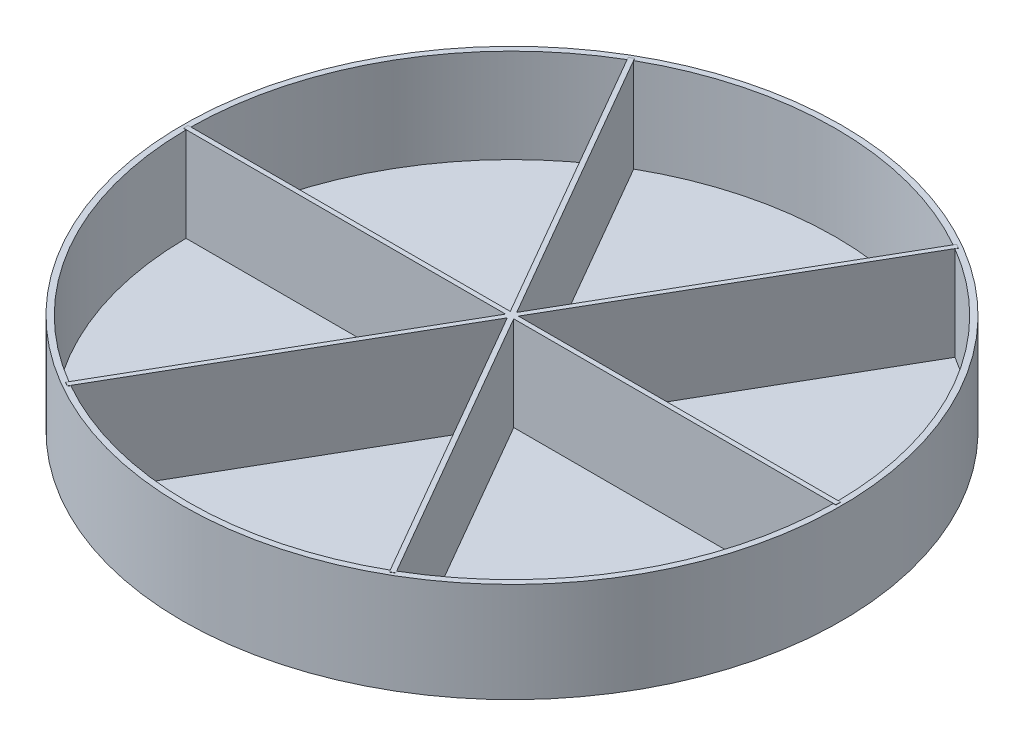
ISO-10303-21;
HEADER;
FILE_DESCRIPTION(('STEP AP214'),'2;1');
FILE_NAME('part.step','',(''),(''),'','','');
FILE_SCHEMA(('AUTOMOTIVE_DESIGN { 1 0 10303 214 1 1 1 1 }'));
ENDSEC;
DATA;
#1=APPLICATION_CONTEXT('core data for automotive mechanical design processes');
#2=APPLICATION_PROTOCOL_DEFINITION('international standard','automotive_design',2000,#1);
#3=PRODUCT_CONTEXT('',#1,'mechanical');
#4=PRODUCT('Part','Part','',(#3));
#5=PRODUCT_RELATED_PRODUCT_CATEGORY('part','',(#4));
#6=PRODUCT_DEFINITION_FORMATION('','',#4);
#7=PRODUCT_DEFINITION_CONTEXT('part definition',#1,'design');
#8=PRODUCT_DEFINITION('design','',#6,#7);
#9=PRODUCT_DEFINITION_SHAPE('','',#8);
#10=(LENGTH_UNIT() NAMED_UNIT(*) SI_UNIT(.MILLI.,.METRE.));
#11=(NAMED_UNIT(*) PLANE_ANGLE_UNIT() SI_UNIT($,.RADIAN.));
#12=(NAMED_UNIT(*) SI_UNIT($,.STERADIAN.) SOLID_ANGLE_UNIT());
#13=UNCERTAINTY_MEASURE_WITH_UNIT(LENGTH_MEASURE(1.E-05),#10,'distance_accuracy_value','');
#14=(GEOMETRIC_REPRESENTATION_CONTEXT(3) GLOBAL_UNCERTAINTY_ASSIGNED_CONTEXT((#13)) GLOBAL_UNIT_ASSIGNED_CONTEXT((#10,
#11,#12)) REPRESENTATION_CONTEXT('',''));
#15=CARTESIAN_POINT('',(0.,0.,0.));
#16=DIRECTION('',(0.,0.,1.));
#17=DIRECTION('',(1.,0.,0.));
#18=AXIS2_PLACEMENT_3D('',#15,#16,#17);
#19=CARTESIAN_POINT('',(0.,53.848,0.));
#20=DIRECTION('',(0.,1.,0.));
#21=DIRECTION('',(0.,0.,1.));
#22=AXIS2_PLACEMENT_3D('',#19,#20,#21);
#23=PLANE('',#22);
#24=CARTESIAN_POINT('',(0.,53.848,0.));
#25=DIRECTION('',(0.,1.,0.));
#26=DIRECTION('',(0.,0.,1.));
#27=AXIS2_PLACEMENT_3D('',#24,#25,#26);
#28=CIRCLE('',#27,177.8);
#29=CARTESIAN_POINT('',(0.,53.848,177.8));
#30=VERTEX_POINT('',#29);
#31=EDGE_CURVE('E494',#30,#30,#28,.T.);
#32=ORIENTED_EDGE('',*,*,#31,.T.);
#33=EDGE_LOOP('',(#32));
#34=FACE_BOUND('',#33,.T.);
#35=DIRECTION('',(0.,0.,1.));
#36=VECTOR('',#35,1.);
#37=CARTESIAN_POINT('',(-175.976362048998,53.848,0.));
#38=LINE('',#37,#36);
#39=CARTESIAN_POINT('',(-175.976362048998,53.848,-1.26999999999995));
#40=VERTEX_POINT('',#39);
#41=CARTESIAN_POINT('',(-175.976362048998,53.848,1.27000000000005));
#42=VERTEX_POINT('',#41);
#43=EDGE_CURVE('E13',#40,#42,#38,.T.);
#44=ORIENTED_EDGE('',*,*,#43,.F.);
#45=DIRECTION('',(1.,0.,0.));
#46=VECTOR('',#45,1.);
#47=CARTESIAN_POINT('',(0.,53.848,-1.26999999999995));
#48=LINE('',#47,#46);
#49=CARTESIAN_POINT('',(-174.620381757113,53.848,-1.26999999999995));
#50=VERTEX_POINT('',#49);
#51=EDGE_CURVE('E482',#40,#50,#48,.T.);
#52=ORIENTED_EDGE('',*,*,#51,.T.);
#53=CARTESIAN_POINT('',(0.,53.848,0.));
#54=DIRECTION('',(0.,1.,0.));
#55=DIRECTION('',(0.,0.,1.));
#56=AXIS2_PLACEMENT_3D('',#53,#54,#55);
#57=CIRCLE('',#56,174.625);
#58=CARTESIAN_POINT('',(-88.4100431413628,53.848,-150.590686620197));
#59=VERTEX_POINT('',#58);
#60=EDGE_CURVE('E589',#59,#50,#57,.T.);
#61=ORIENTED_EDGE('',*,*,#60,.F.);
#62=DIRECTION('',(-0.5,0.,-0.866025403784439));
#63=VECTOR('',#62,1.);
#64=CARTESIAN_POINT('',(-1.0998522628062,53.848,0.634999999999976));
#65=LINE('',#64,#63);
#66=CARTESIAN_POINT('',(-89.0880332873051,53.848,-151.765));
#67=VERTEX_POINT('',#66);
#68=EDGE_CURVE('E441',#59,#67,#65,.T.);
#69=ORIENTED_EDGE('',*,*,#68,.T.);
#70=DIRECTION('',(-0.866025403784439,0.,0.499999999999999));
#71=VECTOR('',#70,1.);
#72=CARTESIAN_POINT('',(-87.9881810244988,53.848,-152.4));
#73=LINE('',#72,#71);
#74=CARTESIAN_POINT('',(-86.8883287616926,53.848,-153.035));
#75=VERTEX_POINT('',#74);
#76=EDGE_CURVE('E515',#75,#67,#73,.T.);
#77=ORIENTED_EDGE('',*,*,#76,.F.);
#78=DIRECTION('',(-0.5,0.,-0.866025403784439));
#79=VECTOR('',#78,1.);
#80=CARTESIAN_POINT('',(1.09985226280627,53.848,-0.635000000000017));
#81=LINE('',#80,#79);
#82=CARTESIAN_POINT('',(-86.2103386157503,53.848,-151.860686620197));
#83=VERTEX_POINT('',#82);
#84=EDGE_CURVE('E430',#83,#75,#81,.T.);
#85=ORIENTED_EDGE('',*,*,#84,.F.);
#86=CARTESIAN_POINT('',(86.2103386157503,53.848,-151.860686620197));
#87=VERTEX_POINT('',#86);
#88=EDGE_CURVE('E592',#87,#83,#57,.T.);
#89=ORIENTED_EDGE('',*,*,#88,.F.);
#90=DIRECTION('',(0.5,0.,-0.866025403784439));
#91=VECTOR('',#90,1.);
#92=CARTESIAN_POINT('',(-1.0998522628063,53.848,-0.635000000000038));
#93=LINE('',#92,#91);
#94=CARTESIAN_POINT('',(86.8883287616926,53.848,-153.035));
#95=VERTEX_POINT('',#94);
#96=EDGE_CURVE('E436',#87,#95,#93,.T.);
#97=ORIENTED_EDGE('',*,*,#96,.T.);
#98=DIRECTION('',(-0.866025403784439,0.,-0.499999999999999));
#99=VECTOR('',#98,1.);
#100=CARTESIAN_POINT('',(87.9881810244988,53.848,-152.4));
#101=LINE('',#100,#99);
#102=CARTESIAN_POINT('',(89.0880332873051,53.848,-151.765));
#103=VERTEX_POINT('',#102);
#104=EDGE_CURVE('E518',#103,#95,#101,.T.);
#105=ORIENTED_EDGE('',*,*,#104,.F.);
#106=DIRECTION('',(0.5,0.,-0.866025403784439));
#107=VECTOR('',#106,1.);
#108=CARTESIAN_POINT('',(1.09985226280617,53.848,0.634999999999962));
#109=LINE('',#108,#107);
#110=CARTESIAN_POINT('',(88.4100431413628,53.848,-150.590686620197));
#111=VERTEX_POINT('',#110);
#112=EDGE_CURVE('E445',#111,#103,#109,.T.);
#113=ORIENTED_EDGE('',*,*,#112,.F.);
#114=CARTESIAN_POINT('',(174.620381757113,53.848,-1.26999999999995));
#115=VERTEX_POINT('',#114);
#116=EDGE_CURVE('E594',#115,#111,#57,.T.);
#117=ORIENTED_EDGE('',*,*,#116,.F.);
#118=DIRECTION('',(1.,0.,0.));
#119=VECTOR('',#118,1.);
#120=CARTESIAN_POINT('',(0.,53.848,-1.26999999999995));
#121=LINE('',#120,#119);
#122=CARTESIAN_POINT('',(175.976362048998,53.848,-1.26999999999995));
#123=VERTEX_POINT('',#122);
#124=EDGE_CURVE('E474',#115,#123,#121,.T.);
#125=ORIENTED_EDGE('',*,*,#124,.T.);
#126=DIRECTION('',(0.,0.,-1.));
#127=VECTOR('',#126,1.);
#128=CARTESIAN_POINT('',(175.976362048998,53.848,0.));
#129=LINE('',#128,#127);
#130=CARTESIAN_POINT('',(175.976362048998,53.848,1.27000000000005));
#131=VERTEX_POINT('',#130);
#132=EDGE_CURVE('E119',#131,#123,#129,.T.);
#133=ORIENTED_EDGE('',*,*,#132,.F.);
#134=DIRECTION('',(1.,0.,0.));
#135=VECTOR('',#134,1.);
#136=CARTESIAN_POINT('',(0.,53.848,1.27000000000005));
#137=LINE('',#136,#135);
#138=CARTESIAN_POINT('',(174.620381757113,53.848,1.27000000000005));
#139=VERTEX_POINT('',#138);
#140=EDGE_CURVE('E468',#139,#131,#137,.T.);
#141=ORIENTED_EDGE('',*,*,#140,.F.);
#142=CARTESIAN_POINT('',(88.4100431413629,53.848,150.590686620197));
#143=VERTEX_POINT('',#142);
#144=EDGE_CURVE('E488',#143,#139,#57,.T.);
#145=ORIENTED_EDGE('',*,*,#144,.F.);
#146=DIRECTION('',(-0.5,0.,-0.866025403784439));
#147=VECTOR('',#146,1.);
#148=CARTESIAN_POINT('',(1.09985226280627,53.848,-0.635000000000017));
#149=LINE('',#148,#147);
#150=CARTESIAN_POINT('',(89.0880332873052,53.848,151.765));
#151=VERTEX_POINT('',#150);
#152=EDGE_CURVE('E455',#151,#143,#149,.T.);
#153=ORIENTED_EDGE('',*,*,#152,.F.);
#154=DIRECTION('',(0.866025403784439,0.,-0.499999999999999));
#155=VECTOR('',#154,1.);
#156=CARTESIAN_POINT('',(87.9881810244988,53.848,152.4));
#157=LINE('',#156,#155);
#158=CARTESIAN_POINT('',(86.8883287616928,53.848,153.035));
#159=VERTEX_POINT('',#158);
#160=EDGE_CURVE('E524',#159,#151,#157,.T.);
#161=ORIENTED_EDGE('',*,*,#160,.F.);
#162=DIRECTION('',(-0.5,0.,-0.866025403784439));
#163=VECTOR('',#162,1.);
#164=CARTESIAN_POINT('',(-1.0998522628062,53.848,0.634999999999976));
#165=LINE('',#164,#163);
#166=CARTESIAN_POINT('',(86.2103386157504,53.848,151.860686620197));
#167=VERTEX_POINT('',#166);
#168=EDGE_CURVE('E325',#159,#167,#165,.T.);
#169=ORIENTED_EDGE('',*,*,#168,.T.);
#170=CARTESIAN_POINT('',(-86.2103386157505,53.848,151.860686620197));
#171=VERTEX_POINT('',#170);
#172=EDGE_CURVE('E484',#171,#167,#57,.T.);
#173=ORIENTED_EDGE('',*,*,#172,.F.);
#174=DIRECTION('',(0.5,0.,-0.866025403784439));
#175=VECTOR('',#174,1.);
#176=CARTESIAN_POINT('',(1.09985226280617,53.848,0.634999999999962));
#177=LINE('',#176,#175);
#178=CARTESIAN_POINT('',(-86.8883287616928,53.848,153.035));
#179=VERTEX_POINT('',#178);
#180=EDGE_CURVE('E463',#179,#171,#177,.T.);
#181=ORIENTED_EDGE('',*,*,#180,.F.);
#182=DIRECTION('',(0.866025403784439,0.,0.499999999999999));
#183=VECTOR('',#182,1.);
#184=CARTESIAN_POINT('',(-87.9881810244988,53.848,152.4));
#185=LINE('',#184,#183);
#186=CARTESIAN_POINT('',(-89.0880332873053,53.848,151.765));
#187=VERTEX_POINT('',#186);
#188=EDGE_CURVE('E521',#187,#179,#185,.T.);
#189=ORIENTED_EDGE('',*,*,#188,.F.);
#190=DIRECTION('',(0.5,0.,-0.866025403784439));
#191=VECTOR('',#190,1.);
#192=CARTESIAN_POINT('',(-1.0998522628063,53.848,-0.635000000000038));
#193=LINE('',#192,#191);
#194=CARTESIAN_POINT('',(-88.410043141363,53.848,150.590686620197));
#195=VERTEX_POINT('',#194);
#196=EDGE_CURVE('E451',#187,#195,#193,.T.);
#197=ORIENTED_EDGE('',*,*,#196,.T.);
#198=CARTESIAN_POINT('',(-174.620381757113,53.848,1.27000000000005));
#199=VERTEX_POINT('',#198);
#200=EDGE_CURVE('E487',#199,#195,#57,.T.);
#201=ORIENTED_EDGE('',*,*,#200,.F.);
#202=DIRECTION('',(1.,0.,0.));
#203=VECTOR('',#202,1.);
#204=CARTESIAN_POINT('',(0.,53.848,1.27000000000005));
#205=LINE('',#204,#203);
#206=EDGE_CURVE('E126',#42,#199,#205,.T.);
#207=ORIENTED_EDGE('',*,*,#206,.F.);
#208=EDGE_LOOP('',(#44,#52,#61,#69,#77,#85,#89,#97,#105,#113,#117,#125,#133,#141,#145,#153,#161,
#169,#173,#181,#189,#197,#201,#207));
#209=FACE_BOUND('',#208,.T.);
#210=ADVANCED_FACE('F111',(#34,#209),#23,.T.);
#211=CARTESIAN_POINT('',(0.,-493.914086658803,0.));
#212=DIRECTION('',(0.,1.,0.));
#213=DIRECTION('',(0.,0.,1.));
#214=AXIS2_PLACEMENT_3D('',#211,#212,#213);
#215=CYLINDRICAL_SURFACE('',#214,174.625);
#216=DIRECTION('',(0.,1.,0.));
#217=VECTOR('',#216,1.);
#218=CARTESIAN_POINT('',(-174.620381757113,-493.914086658803,-1.26999999999995));
#219=LINE('',#218,#217);
#220=CARTESIAN_POINT('',(-174.620381757113,3.17499999999998,-1.26999999999995));
#221=VERTEX_POINT('',#220);
#222=EDGE_CURVE('E479',#221,#50,#219,.T.);
#223=ORIENTED_EDGE('',*,*,#222,.F.);
#224=CARTESIAN_POINT('',(0.,3.17499999999998,0.));
#225=DIRECTION('',(0.,1.,0.));
#226=DIRECTION('',(0.,0.,1.));
#227=AXIS2_PLACEMENT_3D('',#224,#225,#226);
#228=CIRCLE('',#227,174.625);
#229=CARTESIAN_POINT('',(-88.4100431413628,3.17499999999998,-150.590686620197));
#230=VERTEX_POINT('',#229);
#231=EDGE_CURVE('E559',#221,#230,#228,.F.);
#232=ORIENTED_EDGE('',*,*,#231,.T.);
#233=DIRECTION('',(0.,1.,0.));
#234=VECTOR('',#233,1.);
#235=CARTESIAN_POINT('',(-88.4100431413628,-493.914086658803,-150.590686620197));
#236=LINE('',#235,#234);
#237=EDGE_CURVE('E438',#59,#230,#236,.F.);
#238=ORIENTED_EDGE('',*,*,#237,.F.);
#239=ORIENTED_EDGE('',*,*,#60,.T.);
#240=EDGE_LOOP('',(#223,#232,#238,#239));
#241=FACE_BOUND('',#240,.T.);
#242=ADVANCED_FACE('F591',(#241),#215,.F.);
#243=DIRECTION('',(0.,1.,0.));
#244=VECTOR('',#243,1.);
#245=CARTESIAN_POINT('',(174.620381757113,-493.914086658803,-1.26999999999995));
#246=LINE('',#245,#244);
#247=CARTESIAN_POINT('',(174.620381757113,3.17499999999998,-1.26999999999995));
#248=VERTEX_POINT('',#247);
#249=EDGE_CURVE('E471',#115,#248,#246,.F.);
#250=ORIENTED_EDGE('',*,*,#249,.F.);
#251=ORIENTED_EDGE('',*,*,#116,.T.);
#252=DIRECTION('',(0.,1.,0.));
#253=VECTOR('',#252,1.);
#254=CARTESIAN_POINT('',(88.4100431413628,-493.914086658803,-150.590686620197));
#255=LINE('',#254,#253);
#256=CARTESIAN_POINT('',(88.4100431413628,3.17499999999998,-150.590686620197));
#257=VERTEX_POINT('',#256);
#258=EDGE_CURVE('E443',#111,#257,#255,.F.);
#259=ORIENTED_EDGE('',*,*,#258,.T.);
#260=EDGE_CURVE('E553',#257,#248,#228,.F.);
#261=ORIENTED_EDGE('',*,*,#260,.T.);
#262=EDGE_LOOP('',(#250,#251,#259,#261));
#263=FACE_BOUND('',#262,.T.);
#264=ADVANCED_FACE('F624',(#263),#215,.F.);
#265=CARTESIAN_POINT('',(86.2103386157504,3.17499999999998,151.860686620197));
#266=VERTEX_POINT('',#265);
#267=CARTESIAN_POINT('',(-86.2103386157505,3.17499999999998,151.860686620197));
#268=VERTEX_POINT('',#267);
#269=EDGE_CURVE('E489',#266,#268,#228,.F.);
#270=ORIENTED_EDGE('',*,*,#269,.T.);
#271=DIRECTION('',(0.,1.,0.));
#272=VECTOR('',#271,1.);
#273=CARTESIAN_POINT('',(-86.2103386157505,-493.914086658803,151.860686620197));
#274=LINE('',#273,#272);
#275=EDGE_CURVE('E461',#268,#171,#274,.T.);
#276=ORIENTED_EDGE('',*,*,#275,.T.);
#277=ORIENTED_EDGE('',*,*,#172,.T.);
#278=DIRECTION('',(0.,1.,0.));
#279=VECTOR('',#278,1.);
#280=CARTESIAN_POINT('',(86.2103386157504,-493.914086658803,151.860686620197));
#281=LINE('',#280,#279);
#282=EDGE_CURVE('E458',#266,#167,#281,.T.);
#283=ORIENTED_EDGE('',*,*,#282,.F.);
#284=EDGE_LOOP('',(#270,#276,#277,#283));
#285=FACE_BOUND('',#284,.T.);
#286=ADVANCED_FACE('F664',(#285),#215,.F.);
#287=CARTESIAN_POINT('',(-88.410043141363,3.17499999999998,150.590686620197));
#288=VERTEX_POINT('',#287);
#289=CARTESIAN_POINT('',(-174.620381757113,3.17499999999998,1.27000000000005));
#290=VERTEX_POINT('',#289);
#291=EDGE_CURVE('E493',#288,#290,#228,.F.);
#292=ORIENTED_EDGE('',*,*,#291,.T.);
#293=DIRECTION('',(0.,1.,0.));
#294=VECTOR('',#293,1.);
#295=CARTESIAN_POINT('',(-174.620381757113,-493.914086658803,1.27000000000004));
#296=LINE('',#295,#294);
#297=EDGE_CURVE('E476',#290,#199,#296,.T.);
#298=ORIENTED_EDGE('',*,*,#297,.T.);
#299=ORIENTED_EDGE('',*,*,#200,.T.);
#300=DIRECTION('',(0.,1.,0.));
#301=VECTOR('',#300,1.);
#302=CARTESIAN_POINT('',(-88.410043141363,-493.914086658803,150.590686620197));
#303=LINE('',#302,#301);
#304=EDGE_CURVE('E448',#288,#195,#303,.T.);
#305=ORIENTED_EDGE('',*,*,#304,.F.);
#306=EDGE_LOOP('',(#292,#298,#299,#305));
#307=FACE_BOUND('',#306,.T.);
#308=ADVANCED_FACE('F568',(#307),#215,.F.);
#309=ORIENTED_EDGE('',*,*,#144,.T.);
#310=DIRECTION('',(0.,1.,0.));
#311=VECTOR('',#310,1.);
#312=CARTESIAN_POINT('',(174.620381757113,-493.914086658803,1.27000000000004));
#313=LINE('',#312,#311);
#314=CARTESIAN_POINT('',(174.620381757113,3.17499999999998,1.27000000000005));
#315=VERTEX_POINT('',#314);
#316=EDGE_CURVE('E466',#139,#315,#313,.F.);
#317=ORIENTED_EDGE('',*,*,#316,.T.);
#318=CARTESIAN_POINT('',(88.4100431413629,3.17499999999998,150.590686620197));
#319=VERTEX_POINT('',#318);
#320=EDGE_CURVE('E492',#315,#319,#228,.F.);
#321=ORIENTED_EDGE('',*,*,#320,.T.);
#322=DIRECTION('',(0.,1.,0.));
#323=VECTOR('',#322,1.);
#324=CARTESIAN_POINT('',(88.4100431413629,-493.914086658803,150.590686620197));
#325=LINE('',#324,#323);
#326=EDGE_CURVE('E453',#319,#143,#325,.T.);
#327=ORIENTED_EDGE('',*,*,#326,.T.);
#328=EDGE_LOOP('',(#309,#317,#321,#327));
#329=FACE_BOUND('',#328,.T.);
#330=ADVANCED_FACE('F551',(#329),#215,.F.);
#331=DIRECTION('',(0.,1.,0.));
#332=VECTOR('',#331,1.);
#333=CARTESIAN_POINT('',(86.2103386157503,-493.914086658803,-151.860686620197));
#334=LINE('',#333,#332);
#335=CARTESIAN_POINT('',(86.2103386157503,3.17499999999998,-151.860686620197));
#336=VERTEX_POINT('',#335);
#337=EDGE_CURVE('E433',#87,#336,#334,.F.);
#338=ORIENTED_EDGE('',*,*,#337,.F.);
#339=ORIENTED_EDGE('',*,*,#88,.T.);
#340=DIRECTION('',(0.,1.,0.));
#341=VECTOR('',#340,1.);
#342=CARTESIAN_POINT('',(-86.2103386157504,-493.914086658803,-151.860686620197));
#343=LINE('',#342,#341);
#344=CARTESIAN_POINT('',(-86.2103386157504,3.175,-151.860686620197));
#345=VERTEX_POINT('',#344);
#346=EDGE_CURVE('E427',#83,#345,#343,.F.);
#347=ORIENTED_EDGE('',*,*,#346,.T.);
#348=EDGE_CURVE('E555',#345,#336,#228,.F.);
#349=ORIENTED_EDGE('',*,*,#348,.T.);
#350=EDGE_LOOP('',(#338,#339,#347,#349));
#351=FACE_BOUND('',#350,.T.);
#352=ADVANCED_FACE('F613',(#351),#215,.F.);
#353=CARTESIAN_POINT('',(0.,3.175,0.));
#354=DIRECTION('',(0.,1.,0.));
#355=DIRECTION('',(0.,0.,1.));
#356=AXIS2_PLACEMENT_3D('',#353,#354,#355);
#357=PLANE('',#356);
#358=DIRECTION('',(-0.5,0.,0.866025403784439));
#359=VECTOR('',#358,1.);
#360=CARTESIAN_POINT('',(89.0880332873051,3.175,-151.765));
#361=LINE('',#360,#359);
#362=CARTESIAN_POINT('',(0.,3.175,2.53999999999985));
#363=VERTEX_POINT('',#362);
#364=EDGE_CURVE('E375',#363,#268,#361,.T.);
#365=ORIENTED_EDGE('',*,*,#364,.T.);
#366=ORIENTED_EDGE('',*,*,#269,.F.);
#367=DIRECTION('',(0.5,0.,0.866025403784439));
#368=VECTOR('',#367,1.);
#369=CARTESIAN_POINT('',(-89.0880332873051,3.175,-151.765));
#370=LINE('',#369,#368);
#371=EDGE_CURVE('E345',#363,#266,#370,.T.);
#372=ORIENTED_EDGE('',*,*,#371,.F.);
#373=EDGE_LOOP('',(#365,#366,#372));
#374=FACE_BOUND('',#373,.T.);
#375=ADVANCED_FACE('F603',(#374),#357,.T.);
#376=DIRECTION('',(1.,0.,0.));
#377=VECTOR('',#376,1.);
#378=CARTESIAN_POINT('',(0.,3.175,1.27000000000005));
#379=LINE('',#378,#377);
#380=CARTESIAN_POINT('',(2.19970452561257,3.175,1.2700000000001));
#381=VERTEX_POINT('',#380);
#382=EDGE_CURVE('E512',#381,#315,#379,.T.);
#383=ORIENTED_EDGE('',*,*,#382,.F.);
#384=DIRECTION('',(0.5,0.,0.866025403784439));
#385=VECTOR('',#384,1.);
#386=CARTESIAN_POINT('',(-86.8883287616926,3.175,-153.035));
#387=LINE('',#386,#385);
#388=EDGE_CURVE('E318',#381,#319,#387,.T.);
#389=ORIENTED_EDGE('',*,*,#388,.T.);
#390=ORIENTED_EDGE('',*,*,#320,.F.);
#391=EDGE_LOOP('',(#383,#389,#390));
#392=FACE_BOUND('',#391,.T.);
#393=ADVANCED_FACE('F548',(#392),#357,.T.);
#394=DIRECTION('',(0.5,0.,-0.866025403784439));
#395=VECTOR('',#394,1.);
#396=CARTESIAN_POINT('',(1.09985226280617,3.175,0.634999999999962));
#397=LINE('',#396,#395);
#398=CARTESIAN_POINT('',(2.19970452561235,3.175,-1.26999999999994));
#399=VERTEX_POINT('',#398);
#400=EDGE_CURVE('E507',#399,#257,#397,.T.);
#401=ORIENTED_EDGE('',*,*,#400,.F.);
#402=DIRECTION('',(1.,0.,0.));
#403=VECTOR('',#402,1.);
#404=CARTESIAN_POINT('',(0.,3.175,-1.26999999999995));
#405=LINE('',#404,#403);
#406=EDGE_CURVE('E510',#399,#248,#405,.T.);
#407=ORIENTED_EDGE('',*,*,#406,.T.);
#408=ORIENTED_EDGE('',*,*,#260,.F.);
#409=EDGE_LOOP('',(#401,#407,#408));
#410=FACE_BOUND('',#409,.T.);
#411=ADVANCED_FACE('F713',(#410),#357,.T.);
#412=ORIENTED_EDGE('',*,*,#231,.F.);
#413=DIRECTION('',(1.,0.,0.));
#414=VECTOR('',#413,1.);
#415=CARTESIAN_POINT('',(175.976362048998,3.175,-1.26999999999995));
#416=LINE('',#415,#414);
#417=CARTESIAN_POINT('',(-2.19970452561238,3.175,-1.26999999999994));
#418=VERTEX_POINT('',#417);
#419=EDGE_CURVE('E398',#418,#221,#416,.F.);
#420=ORIENTED_EDGE('',*,*,#419,.F.);
#421=DIRECTION('',(-0.5,0.,-0.866025403784439));
#422=VECTOR('',#421,1.);
#423=CARTESIAN_POINT('',(-1.0998522628062,3.175,0.634999999999976));
#424=LINE('',#423,#422);
#425=EDGE_CURVE('E505',#418,#230,#424,.T.);
#426=ORIENTED_EDGE('',*,*,#425,.T.);
#427=EDGE_LOOP('',(#412,#420,#426));
#428=FACE_BOUND('',#427,.T.);
#429=ADVANCED_FACE('F616',(#428),#357,.T.);
#430=DIRECTION('',(-0.5,0.,-0.866025403784439));
#431=VECTOR('',#430,1.);
#432=CARTESIAN_POINT('',(1.09985226280627,3.175,-0.635000000000017));
#433=LINE('',#432,#431);
#434=CARTESIAN_POINT('',(0.,3.175,-2.5400000000001));
#435=VERTEX_POINT('',#434);
#436=EDGE_CURVE('E497',#435,#345,#433,.T.);
#437=ORIENTED_EDGE('',*,*,#436,.F.);
#438=DIRECTION('',(0.5,0.,-0.866025403784439));
#439=VECTOR('',#438,1.);
#440=CARTESIAN_POINT('',(-1.0998522628063,3.175,-0.635000000000038));
#441=LINE('',#440,#439);
#442=EDGE_CURVE('E503',#435,#336,#441,.T.);
#443=ORIENTED_EDGE('',*,*,#442,.T.);
#444=ORIENTED_EDGE('',*,*,#348,.F.);
#445=EDGE_LOOP('',(#437,#443,#444));
#446=FACE_BOUND('',#445,.T.);
#447=ADVANCED_FACE('F604',(#446),#357,.T.);
#448=CARTESIAN_POINT('',(0.,53.848,0.));
#449=DIRECTION('',(0.,-1.,0.));
#450=DIRECTION('',(0.,0.,-1.));
#451=AXIS2_PLACEMENT_3D('',#448,#449,#450);
#452=CYLINDRICAL_SURFACE('',#451,177.8);
#453=ORIENTED_EDGE('',*,*,#31,.F.);
#454=EDGE_LOOP('',(#453));
#455=FACE_BOUND('',#454,.T.);
#456=CARTESIAN_POINT('',(0.,0.,0.));
#457=DIRECTION('',(0.,1.,0.));
#458=DIRECTION('',(0.,0.,1.));
#459=AXIS2_PLACEMENT_3D('',#456,#457,#458);
#460=CIRCLE('',#459,177.8);
#461=CARTESIAN_POINT('',(0.,0.,177.8));
#462=VERTEX_POINT('',#461);
#463=EDGE_CURVE('E498',#462,#462,#460,.T.);
#464=ORIENTED_EDGE('',*,*,#463,.T.);
#465=EDGE_LOOP('',(#464));
#466=FACE_BOUND('',#465,.T.);
#467=ADVANCED_FACE('F113',(#455,#466),#452,.T.);
#468=CARTESIAN_POINT('',(0.,0.,0.));
#469=DIRECTION('',(0.,1.,0.));
#470=DIRECTION('',(0.,0.,1.));
#471=AXIS2_PLACEMENT_3D('',#468,#469,#470);
#472=PLANE('',#471);
#473=ORIENTED_EDGE('',*,*,#463,.F.);
#474=EDGE_LOOP('',(#473));
#475=FACE_BOUND('',#474,.T.);
#476=ADVANCED_FACE('F601',(#475),#472,.F.);
#477=DIRECTION('',(1.,0.,0.));
#478=VECTOR('',#477,1.);
#479=CARTESIAN_POINT('',(175.976362048998,3.175,1.27000000000005));
#480=LINE('',#479,#478);
#481=CARTESIAN_POINT('',(-2.19970452561259,3.175,1.27000000000005));
#482=VERTEX_POINT('',#481);
#483=EDGE_CURVE('E414',#482,#290,#480,.F.);
#484=ORIENTED_EDGE('',*,*,#483,.T.);
#485=ORIENTED_EDGE('',*,*,#291,.F.);
#486=DIRECTION('',(-0.5,0.,0.866025403784439));
#487=VECTOR('',#486,1.);
#488=CARTESIAN_POINT('',(86.8883287616926,3.175,-153.035));
#489=LINE('',#488,#487);
#490=EDGE_CURVE('E358',#482,#288,#489,.T.);
#491=ORIENTED_EDGE('',*,*,#490,.F.);
#492=EDGE_LOOP('',(#484,#485,#491));
#493=FACE_BOUND('',#492,.T.);
#494=ADVANCED_FACE('F599',(#493),#357,.T.);
#495=CARTESIAN_POINT('',(175.976362048998,53.975,-1.26999999999995));
#496=DIRECTION('',(0.,0.,1.));
#497=DIRECTION('',(1.,0.,0.));
#498=AXIS2_PLACEMENT_3D('',#495,#496,#497);
#499=PLANE('',#498);
#500=ORIENTED_EDGE('',*,*,#51,.F.);
#501=DIRECTION('',(0.,-1.,0.));
#502=VECTOR('',#501,1.);
#503=CARTESIAN_POINT('',(-175.976362048998,53.975,-1.26999999999995));
#504=LINE('',#503,#502);
#505=CARTESIAN_POINT('',(-175.976362048998,53.975,-1.26999999999995));
#506=VERTEX_POINT('',#505);
#507=EDGE_CURVE('E424',#506,#40,#504,.T.);
#508=ORIENTED_EDGE('',*,*,#507,.F.);
#509=DIRECTION('',(1.,0.,0.));
#510=VECTOR('',#509,1.);
#511=CARTESIAN_POINT('',(175.976362048998,53.975,-1.26999999999995));
#512=LINE('',#511,#510);
#513=CARTESIAN_POINT('',(-2.19970452561237,53.975,-1.26999999999994));
#514=VERTEX_POINT('',#513);
#515=EDGE_CURVE('E402',#514,#506,#512,.F.);
#516=ORIENTED_EDGE('',*,*,#515,.F.);
#517=DIRECTION('',(0.,1.,0.));
#518=VECTOR('',#517,1.);
#519=CARTESIAN_POINT('',(-2.19970452561241,53.975,-1.26999999999995));
#520=LINE('',#519,#518);
#521=EDGE_CURVE('E388',#418,#514,#520,.T.);
#522=ORIENTED_EDGE('',*,*,#521,.F.);
#523=ORIENTED_EDGE('',*,*,#419,.T.);
#524=ORIENTED_EDGE('',*,*,#222,.T.);
#525=EDGE_LOOP('',(#500,#508,#516,#522,#523,#524));
#526=FACE_BOUND('',#525,.T.);
#527=ADVANCED_FACE('F586',(#526),#499,.F.);
#528=CARTESIAN_POINT('',(175.976362048998,53.975,1.27000000000005));
#529=DIRECTION('',(0.,0.,1.));
#530=DIRECTION('',(1.,0.,0.));
#531=AXIS2_PLACEMENT_3D('',#528,#529,#530);
#532=PLANE('',#531);
#533=DIRECTION('',(0.,-1.,0.));
#534=VECTOR('',#533,1.);
#535=CARTESIAN_POINT('',(-175.976362048998,53.975,1.27000000000005));
#536=LINE('',#535,#534);
#537=CARTESIAN_POINT('',(-175.976362048998,53.975,1.27000000000005));
#538=VERTEX_POINT('',#537);
#539=EDGE_CURVE('E421',#538,#42,#536,.T.);
#540=ORIENTED_EDGE('',*,*,#539,.T.);
#541=ORIENTED_EDGE('',*,*,#206,.T.);
#542=ORIENTED_EDGE('',*,*,#297,.F.);
#543=ORIENTED_EDGE('',*,*,#483,.F.);
#544=DIRECTION('',(0.,1.,0.));
#545=VECTOR('',#544,1.);
#546=CARTESIAN_POINT('',(-2.19970452561258,53.975,1.27000000000005));
#547=LINE('',#546,#545);
#548=CARTESIAN_POINT('',(-2.19970452561262,53.975,1.27000000000005));
#549=VERTEX_POINT('',#548);
#550=EDGE_CURVE('E396',#482,#549,#547,.T.);
#551=ORIENTED_EDGE('',*,*,#550,.T.);
#552=DIRECTION('',(1.,0.,0.));
#553=VECTOR('',#552,1.);
#554=CARTESIAN_POINT('',(175.976362048998,53.975,1.27000000000005));
#555=LINE('',#554,#553);
#556=EDGE_CURVE('E405',#549,#538,#555,.F.);
#557=ORIENTED_EDGE('',*,*,#556,.T.);
#558=EDGE_LOOP('',(#540,#541,#542,#543,#551,#557));
#559=FACE_BOUND('',#558,.T.);
#560=ADVANCED_FACE('F573',(#559),#532,.T.);
#561=ORIENTED_EDGE('',*,*,#124,.F.);
#562=ORIENTED_EDGE('',*,*,#249,.T.);
#563=ORIENTED_EDGE('',*,*,#406,.F.);
#564=DIRECTION('',(0.,1.,0.));
#565=VECTOR('',#564,1.);
#566=CARTESIAN_POINT('',(2.19970452561238,53.975,-1.26999999999995));
#567=LINE('',#566,#565);
#568=CARTESIAN_POINT('',(2.19970452561236,53.975,-1.26999999999995));
#569=VERTEX_POINT('',#568);
#570=EDGE_CURVE('E394',#399,#569,#567,.T.);
#571=ORIENTED_EDGE('',*,*,#570,.T.);
#572=CARTESIAN_POINT('',(175.976362048998,53.975,-1.26999999999995));
#573=VERTEX_POINT('',#572);
#574=EDGE_CURVE('E399',#573,#569,#512,.F.);
#575=ORIENTED_EDGE('',*,*,#574,.F.);
#576=DIRECTION('',(0.,-1.,0.));
#577=VECTOR('',#576,1.);
#578=CARTESIAN_POINT('',(175.976362048998,53.975,-1.26999999999995));
#579=LINE('',#578,#577);
#580=EDGE_CURVE('E411',#573,#123,#579,.T.);
#581=ORIENTED_EDGE('',*,*,#580,.T.);
#582=EDGE_LOOP('',(#561,#562,#563,#571,#575,#581));
#583=FACE_BOUND('',#582,.T.);
#584=ADVANCED_FACE('F531',(#583),#499,.F.);
#585=CARTESIAN_POINT('',(-175.976362048998,53.975,1.27000000000005));
#586=DIRECTION('',(-1.,0.,0.));
#587=DIRECTION('',(0.,0.,1.));
#588=AXIS2_PLACEMENT_3D('',#585,#586,#587);
#589=PLANE('',#588);
#590=ORIENTED_EDGE('',*,*,#507,.T.);
#591=ORIENTED_EDGE('',*,*,#43,.T.);
#592=ORIENTED_EDGE('',*,*,#539,.F.);
#593=DIRECTION('',(0.,0.,-1.));
#594=VECTOR('',#593,1.);
#595=CARTESIAN_POINT('',(-175.976362048998,53.975,1.27000000000005));
#596=LINE('',#595,#594);
#597=EDGE_CURVE('E401',#538,#506,#596,.T.);
#598=ORIENTED_EDGE('',*,*,#597,.T.);
#599=EDGE_LOOP('',(#590,#591,#592,#598));
#600=FACE_BOUND('',#599,.T.);
#601=ADVANCED_FACE('F579',(#600),#589,.T.);
#602=ORIENTED_EDGE('',*,*,#316,.F.);
#603=ORIENTED_EDGE('',*,*,#140,.T.);
#604=DIRECTION('',(0.,-1.,0.));
#605=VECTOR('',#604,1.);
#606=CARTESIAN_POINT('',(175.976362048998,53.975,1.27000000000005));
#607=LINE('',#606,#605);
#608=CARTESIAN_POINT('',(175.976362048998,53.975,1.27000000000005));
#609=VERTEX_POINT('',#608);
#610=EDGE_CURVE('E418',#609,#131,#607,.T.);
#611=ORIENTED_EDGE('',*,*,#610,.F.);
#612=CARTESIAN_POINT('',(2.19970452561259,53.975,1.2700000000001));
#613=VERTEX_POINT('',#612);
#614=EDGE_CURVE('E406',#609,#613,#555,.F.);
#615=ORIENTED_EDGE('',*,*,#614,.T.);
#616=DIRECTION('',(0.,1.,0.));
#617=VECTOR('',#616,1.);
#618=CARTESIAN_POINT('',(2.19970452561255,53.975,1.27000000000005));
#619=LINE('',#618,#617);
#620=EDGE_CURVE('E391',#381,#613,#619,.T.);
#621=ORIENTED_EDGE('',*,*,#620,.F.);
#622=ORIENTED_EDGE('',*,*,#382,.T.);
#623=EDGE_LOOP('',(#602,#603,#611,#615,#621,#622));
#624=FACE_BOUND('',#623,.T.);
#625=ADVANCED_FACE('F540',(#624),#532,.T.);
#626=CARTESIAN_POINT('',(175.976362048998,53.975,-1.26999999999995));
#627=DIRECTION('',(1.,0.,0.));
#628=DIRECTION('',(0.,0.,-1.));
#629=AXIS2_PLACEMENT_3D('',#626,#627,#628);
#630=PLANE('',#629);
#631=ORIENTED_EDGE('',*,*,#610,.T.);
#632=ORIENTED_EDGE('',*,*,#132,.T.);
#633=ORIENTED_EDGE('',*,*,#580,.F.);
#634=DIRECTION('',(0.,0.,1.));
#635=VECTOR('',#634,1.);
#636=CARTESIAN_POINT('',(175.976362048998,53.975,-1.26999999999995));
#637=LINE('',#636,#635);
#638=EDGE_CURVE('E408',#573,#609,#637,.T.);
#639=ORIENTED_EDGE('',*,*,#638,.T.);
#640=EDGE_LOOP('',(#631,#632,#633,#639));
#641=FACE_BOUND('',#640,.T.);
#642=ADVANCED_FACE('F527',(#641),#630,.T.);
#643=CARTESIAN_POINT('',(0.,53.975,0.));
#644=DIRECTION('',(0.,1.,0.));
#645=DIRECTION('',(1.,0.,0.));
#646=AXIS2_PLACEMENT_3D('',#643,#644,#645);
#647=PLANE('',#646);
#648=ORIENTED_EDGE('',*,*,#574,.T.);
#649=DIRECTION('',(-0.5,0.,0.866025403784439));
#650=VECTOR('',#649,1.);
#651=CARTESIAN_POINT('',(89.0880332873051,53.975,-151.765));
#652=LINE('',#651,#650);
#653=CARTESIAN_POINT('',(89.0880332873051,53.975,-151.765));
#654=VERTEX_POINT('',#653);
#655=EDGE_CURVE('E366',#654,#569,#652,.T.);
#656=ORIENTED_EDGE('',*,*,#655,.F.);
#657=DIRECTION('',(0.866025403784439,0.,0.499999999999999));
#658=VECTOR('',#657,1.);
#659=CARTESIAN_POINT('',(86.8883287616926,53.975,-153.035));
#660=LINE('',#659,#658);
#661=CARTESIAN_POINT('',(86.8883287616926,53.975,-153.035));
#662=VERTEX_POINT('',#661);
#663=EDGE_CURVE('E369',#662,#654,#660,.T.);
#664=ORIENTED_EDGE('',*,*,#663,.F.);
#665=DIRECTION('',(-0.5,0.,0.866025403784439));
#666=VECTOR('',#665,1.);
#667=CARTESIAN_POINT('',(86.8883287616926,53.975,-153.035));
#668=LINE('',#667,#666);
#669=CARTESIAN_POINT('',(0.,53.975,-2.54000000000016));
#670=VERTEX_POINT('',#669);
#671=EDGE_CURVE('E359',#662,#670,#668,.T.);
#672=ORIENTED_EDGE('',*,*,#671,.T.);
#673=DIRECTION('',(0.5,0.,0.866025403784439));
#674=VECTOR('',#673,1.);
#675=CARTESIAN_POINT('',(-86.8883287616926,53.975,-153.035));
#676=LINE('',#675,#674);
#677=CARTESIAN_POINT('',(-86.8883287616926,53.975,-153.035));
#678=VERTEX_POINT('',#677);
#679=EDGE_CURVE('E336',#678,#670,#676,.T.);
#680=ORIENTED_EDGE('',*,*,#679,.F.);
#681=DIRECTION('',(0.866025403784439,0.,-0.499999999999999));
#682=VECTOR('',#681,1.);
#683=CARTESIAN_POINT('',(-89.0880332873051,53.975,-151.765));
#684=LINE('',#683,#682);
#685=CARTESIAN_POINT('',(-89.0880332873051,53.975,-151.765));
#686=VERTEX_POINT('',#685);
#687=EDGE_CURVE('E341',#686,#678,#684,.T.);
#688=ORIENTED_EDGE('',*,*,#687,.F.);
#689=DIRECTION('',(0.5,0.,0.866025403784439));
#690=VECTOR('',#689,1.);
#691=CARTESIAN_POINT('',(-89.0880332873051,53.975,-151.765));
#692=LINE('',#691,#690);
#693=EDGE_CURVE('E317',#686,#514,#692,.T.);
#694=ORIENTED_EDGE('',*,*,#693,.T.);
#695=ORIENTED_EDGE('',*,*,#515,.T.);
#696=ORIENTED_EDGE('',*,*,#597,.F.);
#697=ORIENTED_EDGE('',*,*,#556,.F.);
#698=CARTESIAN_POINT('',(-89.0880332873053,53.975,151.765));
#699=VERTEX_POINT('',#698);
#700=EDGE_CURVE('E363',#549,#699,#668,.T.);
#701=ORIENTED_EDGE('',*,*,#700,.T.);
#702=DIRECTION('',(-0.866025403784439,0.,-0.499999999999999));
#703=VECTOR('',#702,1.);
#704=CARTESIAN_POINT('',(-86.8883287616928,53.975,153.035));
#705=LINE('',#704,#703);
#706=CARTESIAN_POINT('',(-86.8883287616928,53.975,153.035));
#707=VERTEX_POINT('',#706);
#708=EDGE_CURVE('E362',#707,#699,#705,.T.);
#709=ORIENTED_EDGE('',*,*,#708,.F.);
#710=CARTESIAN_POINT('',(0.,53.975,2.53999999999985));
#711=VERTEX_POINT('',#710);
#712=EDGE_CURVE('E313',#711,#707,#652,.T.);
#713=ORIENTED_EDGE('',*,*,#712,.F.);
#714=CARTESIAN_POINT('',(86.8883287616928,53.975,153.035));
#715=VERTEX_POINT('',#714);
#716=EDGE_CURVE('E305',#711,#715,#692,.T.);
#717=ORIENTED_EDGE('',*,*,#716,.T.);
#718=DIRECTION('',(-0.866025403784439,0.,0.499999999999999));
#719=VECTOR('',#718,1.);
#720=CARTESIAN_POINT('',(89.0880332873052,53.975,151.765));
#721=LINE('',#720,#719);
#722=CARTESIAN_POINT('',(89.0880332873052,53.975,151.765));
#723=VERTEX_POINT('',#722);
#724=EDGE_CURVE('E311',#723,#715,#721,.T.);
#725=ORIENTED_EDGE('',*,*,#724,.F.);
#726=EDGE_CURVE('E334',#613,#723,#676,.T.);
#727=ORIENTED_EDGE('',*,*,#726,.F.);
#728=ORIENTED_EDGE('',*,*,#614,.F.);
#729=ORIENTED_EDGE('',*,*,#638,.F.);
#730=EDGE_LOOP('',(#648,#656,#664,#672,#680,#688,#694,#695,#696,#697,#701,#709,#713,#717,#725,
#727,#728,#729));
#731=FACE_BOUND('',#730,.T.);
#732=ADVANCED_FACE('F308',(#731),#647,.T.);
#733=CARTESIAN_POINT('',(-86.8883287616928,53.975,153.035));
#734=DIRECTION('',(-0.499999999999999,0.,0.866025403784439));
#735=DIRECTION('',(0.866025403784439,0.,0.499999999999999));
#736=AXIS2_PLACEMENT_3D('',#733,#734,#735);
#737=PLANE('',#736);
#738=DIRECTION('',(0.,-1.,0.));
#739=VECTOR('',#738,1.);
#740=CARTESIAN_POINT('',(-89.0880332873053,53.975,151.765));
#741=LINE('',#740,#739);
#742=EDGE_CURVE('E385',#699,#187,#741,.T.);
#743=ORIENTED_EDGE('',*,*,#742,.T.);
#744=ORIENTED_EDGE('',*,*,#188,.T.);
#745=DIRECTION('',(0.,-1.,0.));
#746=VECTOR('',#745,1.);
#747=CARTESIAN_POINT('',(-86.8883287616928,53.975,153.035));
#748=LINE('',#747,#746);
#749=EDGE_CURVE('E382',#707,#179,#748,.T.);
#750=ORIENTED_EDGE('',*,*,#749,.F.);
#751=ORIENTED_EDGE('',*,*,#708,.T.);
#752=EDGE_LOOP('',(#743,#744,#750,#751));
#753=FACE_BOUND('',#752,.T.);
#754=ADVANCED_FACE('F801',(#753),#737,.T.);
#755=CARTESIAN_POINT('',(89.0880332873051,53.975,-151.765));
#756=DIRECTION('',(0.866025403784439,0.,0.5));
#757=DIRECTION('',(0.5,0.,-0.866025403784439));
#758=AXIS2_PLACEMENT_3D('',#755,#756,#757);
#759=PLANE('',#758);
#760=ORIENTED_EDGE('',*,*,#749,.T.);
#761=ORIENTED_EDGE('',*,*,#180,.T.);
#762=ORIENTED_EDGE('',*,*,#275,.F.);
#763=ORIENTED_EDGE('',*,*,#364,.F.);
#764=DIRECTION('',(0.,1.,0.));
#765=VECTOR('',#764,1.);
#766=CARTESIAN_POINT('',(0.,53.975,2.53999999999988));
#767=LINE('',#766,#765);
#768=EDGE_CURVE('E356',#363,#711,#767,.T.);
#769=ORIENTED_EDGE('',*,*,#768,.T.);
#770=ORIENTED_EDGE('',*,*,#712,.T.);
#771=EDGE_LOOP('',(#760,#761,#762,#763,#769,#770));
#772=FACE_BOUND('',#771,.T.);
#773=ADVANCED_FACE('F810',(#772),#759,.T.);
#774=CARTESIAN_POINT('',(-89.0880332873051,53.975,-151.765));
#775=DIRECTION('',(0.866025403784439,0.,-0.5));
#776=DIRECTION('',(-0.5,0.,-0.866025403784439));
#777=AXIS2_PLACEMENT_3D('',#774,#775,#776);
#778=PLANE('',#777);
#779=ORIENTED_EDGE('',*,*,#168,.F.);
#780=DIRECTION('',(0.,-1.,0.));
#781=VECTOR('',#780,1.);
#782=CARTESIAN_POINT('',(86.8883287616928,53.975,153.035));
#783=LINE('',#782,#781);
#784=EDGE_CURVE('E322',#715,#159,#783,.T.);
#785=ORIENTED_EDGE('',*,*,#784,.F.);
#786=ORIENTED_EDGE('',*,*,#716,.F.);
#787=ORIENTED_EDGE('',*,*,#768,.F.);
#788=ORIENTED_EDGE('',*,*,#371,.T.);
#789=ORIENTED_EDGE('',*,*,#282,.T.);
#790=EDGE_LOOP('',(#779,#785,#786,#787,#788,#789));
#791=FACE_BOUND('',#790,.T.);
#792=ADVANCED_FACE('F323',(#791),#778,.F.);
#793=CARTESIAN_POINT('',(89.0880332873052,53.975,151.765));
#794=DIRECTION('',(0.499999999999999,0.,0.866025403784439));
#795=DIRECTION('',(0.866025403784439,0.,-0.499999999999999));
#796=AXIS2_PLACEMENT_3D('',#793,#794,#795);
#797=PLANE('',#796);
#798=ORIENTED_EDGE('',*,*,#784,.T.);
#799=ORIENTED_EDGE('',*,*,#160,.T.);
#800=DIRECTION('',(0.,-1.,0.));
#801=VECTOR('',#800,1.);
#802=CARTESIAN_POINT('',(89.0880332873052,53.975,151.765));
#803=LINE('',#802,#801);
#804=EDGE_CURVE('E329',#723,#151,#803,.T.);
#805=ORIENTED_EDGE('',*,*,#804,.F.);
#806=ORIENTED_EDGE('',*,*,#724,.T.);
#807=EDGE_LOOP('',(#798,#799,#805,#806));
#808=FACE_BOUND('',#807,.T.);
#809=ADVANCED_FACE('F332',(#808),#797,.T.);
#810=CARTESIAN_POINT('',(-86.8883287616926,53.975,-153.035));
#811=DIRECTION('',(0.866025403784439,0.,-0.5));
#812=DIRECTION('',(-0.5,0.,-0.866025403784439));
#813=AXIS2_PLACEMENT_3D('',#810,#811,#812);
#814=PLANE('',#813);
#815=ORIENTED_EDGE('',*,*,#804,.T.);
#816=ORIENTED_EDGE('',*,*,#152,.T.);
#817=ORIENTED_EDGE('',*,*,#326,.F.);
#818=ORIENTED_EDGE('',*,*,#388,.F.);
#819=ORIENTED_EDGE('',*,*,#620,.T.);
#820=ORIENTED_EDGE('',*,*,#726,.T.);
#821=EDGE_LOOP('',(#815,#816,#817,#818,#819,#820));
#822=FACE_BOUND('',#821,.T.);
#823=ADVANCED_FACE('F543',(#822),#814,.T.);
#824=CARTESIAN_POINT('',(86.8883287616926,53.975,-153.035));
#825=DIRECTION('',(0.866025403784439,0.,0.5));
#826=DIRECTION('',(0.5,0.,-0.866025403784439));
#827=AXIS2_PLACEMENT_3D('',#824,#825,#826);
#828=PLANE('',#827);
#829=ORIENTED_EDGE('',*,*,#196,.F.);
#830=ORIENTED_EDGE('',*,*,#742,.F.);
#831=ORIENTED_EDGE('',*,*,#700,.F.);
#832=ORIENTED_EDGE('',*,*,#550,.F.);
#833=ORIENTED_EDGE('',*,*,#490,.T.);
#834=ORIENTED_EDGE('',*,*,#304,.T.);
#835=EDGE_LOOP('',(#829,#830,#831,#832,#833,#834));
#836=FACE_BOUND('',#835,.T.);
#837=ADVANCED_FACE('F597',(#836),#828,.F.);
#838=ORIENTED_EDGE('',*,*,#258,.F.);
#839=ORIENTED_EDGE('',*,*,#112,.T.);
#840=DIRECTION('',(0.,-1.,0.));
#841=VECTOR('',#840,1.);
#842=CARTESIAN_POINT('',(89.0880332873051,53.975,-151.765));
#843=LINE('',#842,#841);
#844=EDGE_CURVE('E379',#654,#103,#843,.T.);
#845=ORIENTED_EDGE('',*,*,#844,.F.);
#846=ORIENTED_EDGE('',*,*,#655,.T.);
#847=ORIENTED_EDGE('',*,*,#570,.F.);
#848=ORIENTED_EDGE('',*,*,#400,.T.);
#849=EDGE_LOOP('',(#838,#839,#845,#846,#847,#848));
#850=FACE_BOUND('',#849,.T.);
#851=ADVANCED_FACE('F822',(#850),#759,.T.);
#852=ORIENTED_EDGE('',*,*,#68,.F.);
#853=ORIENTED_EDGE('',*,*,#237,.T.);
#854=ORIENTED_EDGE('',*,*,#425,.F.);
#855=ORIENTED_EDGE('',*,*,#521,.T.);
#856=ORIENTED_EDGE('',*,*,#693,.F.);
#857=DIRECTION('',(0.,-1.,0.));
#858=VECTOR('',#857,1.);
#859=CARTESIAN_POINT('',(-89.0880332873051,53.975,-151.765));
#860=LINE('',#859,#858);
#861=EDGE_CURVE('E344',#686,#67,#860,.T.);
#862=ORIENTED_EDGE('',*,*,#861,.T.);
#863=EDGE_LOOP('',(#852,#853,#854,#855,#856,#862));
#864=FACE_BOUND('',#863,.T.);
#865=ADVANCED_FACE('F832',(#864),#778,.F.);
#866=ORIENTED_EDGE('',*,*,#96,.F.);
#867=ORIENTED_EDGE('',*,*,#337,.T.);
#868=ORIENTED_EDGE('',*,*,#442,.F.);
#869=DIRECTION('',(0.,1.,0.));
#870=VECTOR('',#869,1.);
#871=CARTESIAN_POINT('',(0.,53.975,-2.54000000000013));
#872=LINE('',#871,#870);
#873=EDGE_CURVE('E328',#435,#670,#872,.T.);
#874=ORIENTED_EDGE('',*,*,#873,.T.);
#875=ORIENTED_EDGE('',*,*,#671,.F.);
#876=DIRECTION('',(0.,-1.,0.));
#877=VECTOR('',#876,1.);
#878=CARTESIAN_POINT('',(86.8883287616926,53.975,-153.035));
#879=LINE('',#878,#877);
#880=EDGE_CURVE('E372',#662,#95,#879,.T.);
#881=ORIENTED_EDGE('',*,*,#880,.T.);
#882=EDGE_LOOP('',(#866,#867,#868,#874,#875,#881));
#883=FACE_BOUND('',#882,.T.);
#884=ADVANCED_FACE('F858',(#883),#828,.F.);
#885=CARTESIAN_POINT('',(86.8883287616926,53.975,-153.035));
#886=DIRECTION('',(0.499999999999999,0.,-0.866025403784439));
#887=DIRECTION('',(-0.866025403784439,0.,-0.499999999999999));
#888=AXIS2_PLACEMENT_3D('',#885,#886,#887);
#889=PLANE('',#888);
#890=ORIENTED_EDGE('',*,*,#844,.T.);
#891=ORIENTED_EDGE('',*,*,#104,.T.);
#892=ORIENTED_EDGE('',*,*,#880,.F.);
#893=ORIENTED_EDGE('',*,*,#663,.T.);
#894=EDGE_LOOP('',(#890,#891,#892,#893));
#895=FACE_BOUND('',#894,.T.);
#896=ADVANCED_FACE('F882',(#895),#889,.T.);
#897=ORIENTED_EDGE('',*,*,#346,.F.);
#898=ORIENTED_EDGE('',*,*,#84,.T.);
#899=DIRECTION('',(0.,-1.,0.));
#900=VECTOR('',#899,1.);
#901=CARTESIAN_POINT('',(-86.8883287616926,53.975,-153.035));
#902=LINE('',#901,#900);
#903=EDGE_CURVE('E351',#678,#75,#902,.T.);
#904=ORIENTED_EDGE('',*,*,#903,.F.);
#905=ORIENTED_EDGE('',*,*,#679,.T.);
#906=ORIENTED_EDGE('',*,*,#873,.F.);
#907=ORIENTED_EDGE('',*,*,#436,.T.);
#908=EDGE_LOOP('',(#897,#898,#904,#905,#906,#907));
#909=FACE_BOUND('',#908,.T.);
#910=ADVANCED_FACE('F849',(#909),#814,.T.);
#911=CARTESIAN_POINT('',(-89.0880332873051,53.975,-151.765));
#912=DIRECTION('',(-0.499999999999999,0.,-0.866025403784439));
#913=DIRECTION('',(-0.866025403784439,0.,0.499999999999999));
#914=AXIS2_PLACEMENT_3D('',#911,#912,#913);
#915=PLANE('',#914);
#916=ORIENTED_EDGE('',*,*,#903,.T.);
#917=ORIENTED_EDGE('',*,*,#76,.T.);
#918=ORIENTED_EDGE('',*,*,#861,.F.);
#919=ORIENTED_EDGE('',*,*,#687,.T.);
#920=EDGE_LOOP('',(#916,#917,#918,#919));
#921=FACE_BOUND('',#920,.T.);
#922=ADVANCED_FACE('F900',(#921),#915,.T.);
#923=CLOSED_SHELL('',(#210,#242,#264,#286,#308,#330,#352,#375,#393,#411,#429,#447,#467,#476,
#494,#527,#560,#584,#601,#625,#642,#732,#754,#773,#792,#809,#823,#837,#851,#865,#884,#896,#910,#922));
#924=MANIFOLD_SOLID_BREP('B2',#923);
#925=ADVANCED_BREP_SHAPE_REPRESENTATION('',(#18,#924),#14);
#926=SHAPE_DEFINITION_REPRESENTATION(#9,#925);
ENDSEC;
END-ISO-10303-21;
